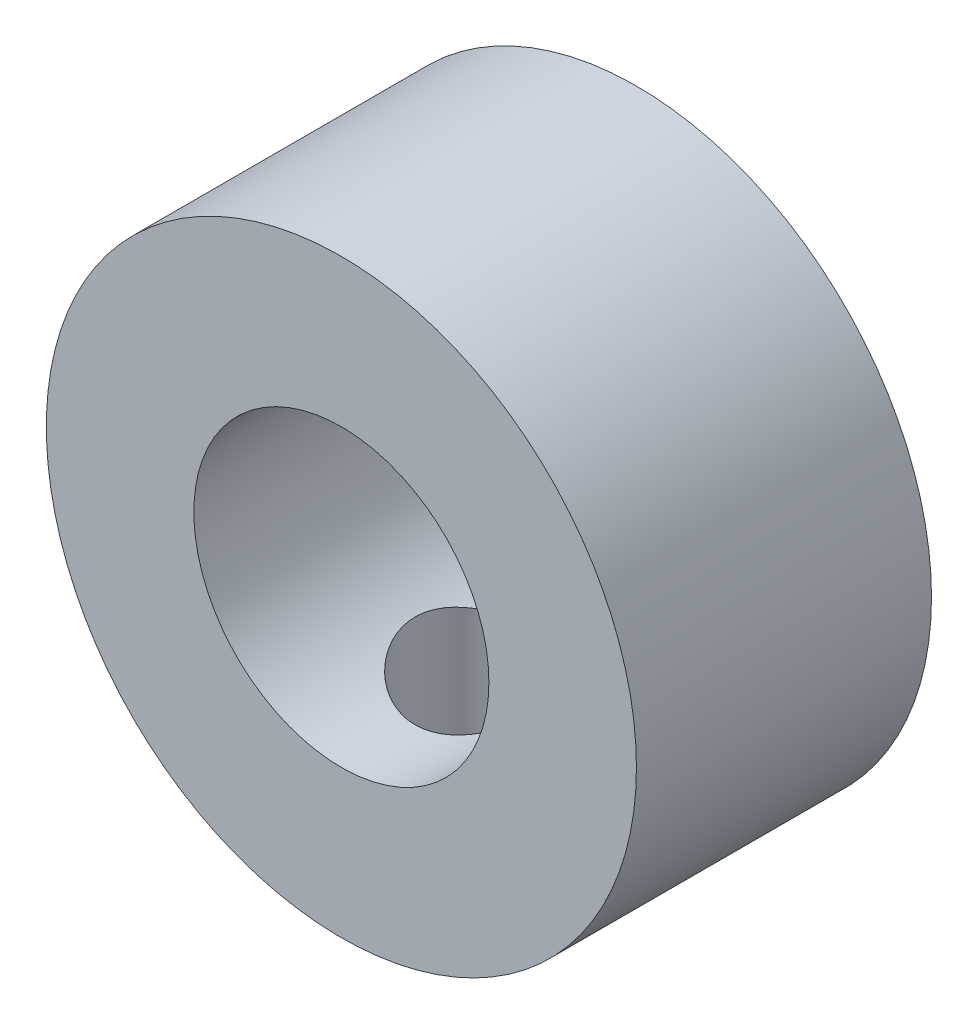
ISO-10303-21;
HEADER;
FILE_DESCRIPTION(('STEP AP214'),'2;1');
FILE_NAME('part.step','',(''),(''),'','','');
FILE_SCHEMA(('AUTOMOTIVE_DESIGN { 1 0 10303 214 1 1 1 1 }'));
ENDSEC;
DATA;
#1=APPLICATION_CONTEXT('core data for automotive mechanical design processes');
#2=APPLICATION_PROTOCOL_DEFINITION('international standard','automotive_design',2000,#1);
#3=PRODUCT_CONTEXT('',#1,'mechanical');
#4=PRODUCT('Part','Part','',(#3));
#5=PRODUCT_RELATED_PRODUCT_CATEGORY('part','',(#4));
#6=PRODUCT_DEFINITION_FORMATION('','',#4);
#7=PRODUCT_DEFINITION_CONTEXT('part definition',#1,'design');
#8=PRODUCT_DEFINITION('design','',#6,#7);
#9=PRODUCT_DEFINITION_SHAPE('','',#8);
#10=(LENGTH_UNIT() NAMED_UNIT(*) SI_UNIT(.MILLI.,.METRE.));
#11=(NAMED_UNIT(*) PLANE_ANGLE_UNIT() SI_UNIT($,.RADIAN.));
#12=(NAMED_UNIT(*) SI_UNIT($,.STERADIAN.) SOLID_ANGLE_UNIT());
#13=UNCERTAINTY_MEASURE_WITH_UNIT(LENGTH_MEASURE(1.E-05),#10,'distance_accuracy_value','');
#14=(GEOMETRIC_REPRESENTATION_CONTEXT(3) GLOBAL_UNCERTAINTY_ASSIGNED_CONTEXT((#13)) GLOBAL_UNIT_ASSIGNED_CONTEXT((#10,
#11,#12)) REPRESENTATION_CONTEXT('',''));
#15=CARTESIAN_POINT('',(0.,0.,0.));
#16=DIRECTION('',(0.,0.,1.));
#17=DIRECTION('',(1.,0.,0.));
#18=AXIS2_PLACEMENT_3D('',#15,#16,#17);
#19=CARTESIAN_POINT('',(0.,0.,5.));
#20=DIRECTION('',(0.,0.,1.));
#21=DIRECTION('',(1.,0.,0.));
#22=AXIS2_PLACEMENT_3D('',#19,#20,#21);
#23=PLANE('',#22);
#24=CARTESIAN_POINT('',(0.,0.,5.));
#25=DIRECTION('',(0.,0.,1.));
#26=DIRECTION('',(1.,0.,0.));
#27=AXIS2_PLACEMENT_3D('',#24,#25,#26);
#28=CIRCLE('',#27,5.);
#29=CARTESIAN_POINT('',(5.,0.,5.));
#30=VERTEX_POINT('',#29);
#31=EDGE_CURVE('E10',#30,#30,#28,.T.);
#32=ORIENTED_EDGE('',*,*,#31,.T.);
#33=EDGE_LOOP('',(#32));
#34=FACE_BOUND('',#33,.T.);
#35=CARTESIAN_POINT('',(0.,0.,5.));
#36=DIRECTION('',(0.,0.,1.));
#37=DIRECTION('',(1.,0.,0.));
#38=AXIS2_PLACEMENT_3D('',#35,#36,#37);
#39=CIRCLE('',#38,2.5);
#40=CARTESIAN_POINT('',(2.5,0.,5.));
#41=VERTEX_POINT('',#40);
#42=EDGE_CURVE('E56',#41,#41,#39,.T.);
#43=ORIENTED_EDGE('',*,*,#42,.F.);
#44=EDGE_LOOP('',(#43));
#45=FACE_BOUND('',#44,.T.);
#46=ADVANCED_FACE('F37',(#34,#45),#23,.T.);
#47=CARTESIAN_POINT('',(0.,0.,0.));
#48=DIRECTION('',(0.,0.,1.));
#49=DIRECTION('',(1.,0.,0.));
#50=AXIS2_PLACEMENT_3D('',#47,#48,#49);
#51=PLANE('',#50);
#52=CARTESIAN_POINT('',(0.,0.,0.));
#53=DIRECTION('',(0.,0.,1.));
#54=DIRECTION('',(1.,0.,0.));
#55=AXIS2_PLACEMENT_3D('',#52,#53,#54);
#56=CIRCLE('',#55,5.);
#57=CARTESIAN_POINT('',(5.,0.,0.));
#58=VERTEX_POINT('',#57);
#59=EDGE_CURVE('E51',#58,#58,#56,.T.);
#60=ORIENTED_EDGE('',*,*,#59,.F.);
#61=EDGE_LOOP('',(#60));
#62=FACE_BOUND('',#61,.T.);
#63=CARTESIAN_POINT('',(0.,0.,0.));
#64=DIRECTION('',(0.,0.,1.));
#65=DIRECTION('',(1.,0.,0.));
#66=AXIS2_PLACEMENT_3D('',#63,#64,#65);
#67=CIRCLE('',#66,2.5);
#68=CARTESIAN_POINT('',(2.5,0.,0.));
#69=VERTEX_POINT('',#68);
#70=EDGE_CURVE('E58',#69,#69,#67,.T.);
#71=ORIENTED_EDGE('',*,*,#70,.T.);
#72=EDGE_LOOP('',(#71));
#73=FACE_BOUND('',#72,.T.);
#74=ADVANCED_FACE('F79',(#62,#73),#51,.F.);
#75=CARTESIAN_POINT('',(0.,0.,5.));
#76=DIRECTION('',(0.,0.,-1.));
#77=DIRECTION('',(-1.,0.,0.));
#78=AXIS2_PLACEMENT_3D('',#75,#76,#77);
#79=CYLINDRICAL_SURFACE('',#78,5.);
#80=CARTESIAN_POINT('',(0.,-5.,3.75));
#81=CARTESIAN_POINT('',(0.0690634072247759,-4.99999883223344,3.74999806188487));
#82=CARTESIAN_POINT('',(0.138148464858969,-4.99855481776523,3.74425704102184));
#83=CARTESIAN_POINT('',(0.27433860314211,-4.99293428191577,3.7214790405775));
#84=CARTESIAN_POINT('',(0.341442539058949,-4.98875621183307,3.70443565871846));
#85=CARTESIAN_POINT('',(0.471684060152148,-4.97813021943366,3.65963395544826));
#86=CARTESIAN_POINT('',(0.534826302858336,-4.97168502368406,3.6318885010706));
#87=CARTESIAN_POINT('',(0.655560109920356,-4.95721119839661,3.56651550829597));
#88=CARTESIAN_POINT('',(0.713151486957299,-4.94918251545042,3.52888763656755));
#89=CARTESIAN_POINT('',(0.822334939417433,-4.93222844659834,3.44399934195482));
#90=CARTESIAN_POINT('',(0.873796408384227,-4.92328922623777,3.39657368753402));
#91=CARTESIAN_POINT('',(0.968124106002754,-4.90561350097941,3.29378982924257));
#92=CARTESIAN_POINT('',(1.01098936412428,-4.89687701906957,3.23843073087792));
#93=CARTESIAN_POINT('',(1.08752211899919,-4.88045646416425,3.12033731105214));
#94=CARTESIAN_POINT('',(1.12104351327113,-4.87278995392171,3.05750564099133));
#95=CARTESIAN_POINT('',(1.17699742379211,-4.85957912343519,2.92687632361803));
#96=CARTESIAN_POINT('',(1.19943171286611,-4.85403446393991,2.85907947222853));
#97=CARTESIAN_POINT('',(1.23212903067024,-4.84583730597959,2.7218804181646));
#98=CARTESIAN_POINT('',(1.24262689027778,-4.84312909229522,2.65253758662517));
#99=CARTESIAN_POINT('',(1.25188481255654,-4.84074468781451,2.51302619248835));
#100=CARTESIAN_POINT('',(1.25064678484831,-4.8410680037387,2.44285776608449));
#101=CARTESIAN_POINT('',(1.2366554371994,-4.84466004580515,2.3054868268796));
#102=CARTESIAN_POINT('',(1.22418195015877,-4.84785719168233,2.23825364877909));
#103=CARTESIAN_POINT('',(1.18852015575259,-4.85672258063736,2.10686579090726));
#104=CARTESIAN_POINT('',(1.16533108505785,-4.8623909997558,2.04271133080918));
#105=CARTESIAN_POINT('',(1.10865789828096,-4.87562594920155,1.91855165312328));
#106=CARTESIAN_POINT('',(1.07507222269409,-4.88321106224518,1.85859485684204));
#107=CARTESIAN_POINT('',(0.998630230012462,-4.89941425705322,1.7450677418693));
#108=CARTESIAN_POINT('',(0.955772290674033,-4.90803251945613,1.69149854327729));
#109=CARTESIAN_POINT('',(0.860552853901015,-4.92563233783151,1.590663653588));
#110=CARTESIAN_POINT('',(0.807955215138217,-4.93461724564976,1.54362125828221));
#111=CARTESIAN_POINT('',(0.695509931253083,-4.95171637982321,1.45898229794675));
#112=CARTESIAN_POINT('',(0.63566206475662,-4.95983057957846,1.42138602144703));
#113=CARTESIAN_POINT('',(0.51009657390116,-4.97431443411819,1.35662451147968));
#114=CARTESIAN_POINT('',(0.44435949434052,-4.98067800106438,1.32949554978798));
#115=CARTESIAN_POINT('',(0.309063340119069,-4.99089930826182,1.28673557857536));
#116=CARTESIAN_POINT('',(0.239504999292071,-4.99475752782734,1.27110236965155));
#117=CARTESIAN_POINT('',(0.100449975325023,-4.99946249392812,1.25211869536764));
#118=CARTESIAN_POINT('',(0.0309972666568417,-5.00038377923565,1.24846414493725));
#119=CARTESIAN_POINT('',(-0.107527395667923,-4.99932337345376,1.25270750171291));
#120=CARTESIAN_POINT('',(-0.176599383037162,-4.99734194368205,1.26060436899928));
#121=CARTESIAN_POINT('',(-0.31134522398041,-4.99074650939464,1.28747575699282));
#122=CARTESIAN_POINT('',(-0.377054265807296,-4.98617195154843,1.30628438623082));
#123=CARTESIAN_POINT('',(-0.50438107704376,-4.97490588861778,1.35425590335704));
#124=CARTESIAN_POINT('',(-0.565998432527196,-4.9682141697491,1.38341983692764));
#125=CARTESIAN_POINT('',(-0.684602612024873,-4.95327756605259,1.45186344072894));
#126=CARTESIAN_POINT('',(-0.741487868196525,-4.94500722805777,1.4913134269973));
#127=CARTESIAN_POINT('',(-0.847938844702705,-4.92787090989516,1.57899159066414));
#128=CARTESIAN_POINT('',(-0.897503299144173,-4.91900482709754,1.62722128301409));
#129=CARTESIAN_POINT('',(-0.989158806727275,-4.90140797467309,1.73250163403705));
#130=CARTESIAN_POINT('',(-1.03103655635169,-4.89268586822734,1.78973975250202));
#131=CARTESIAN_POINT('',(-1.10459229917725,-4.87660731981032,1.91061052872143));
#132=CARTESIAN_POINT('',(-1.13627074513161,-4.86925081722522,1.97424290246646));
#133=CARTESIAN_POINT('',(-1.18829285050774,-4.85681745612221,2.10575476867756));
#134=CARTESIAN_POINT('',(-1.20870366387839,-4.85172712743255,2.17360635695334));
#135=CARTESIAN_POINT('',(-1.23778804996148,-4.84438953408486,2.31192469824092));
#136=CARTESIAN_POINT('',(-1.24646418956555,-4.84214164766613,2.38239087586041));
#137=CARTESIAN_POINT('',(-1.25169882527833,-4.84079084336631,2.52176751987934));
#138=CARTESIAN_POINT('',(-1.2485982481501,-4.8415994394022,2.59066452927061));
#139=CARTESIAN_POINT('',(-1.23114773192739,-4.84606590839869,2.72691990722332));
#140=CARTESIAN_POINT('',(-1.21679801890564,-4.84972372409881,2.79427830667804));
#141=CARTESIAN_POINT('',(-1.17744276620233,-4.85942717235602,2.92517371588784));
#142=CARTESIAN_POINT('',(-1.15250117056698,-4.86545846030258,2.98873108770017));
#143=CARTESIAN_POINT('',(-1.09272076133756,-4.8792312977069,3.11080448559474));
#144=CARTESIAN_POINT('',(-1.05788057502849,-4.88697308433977,3.1693198109891));
#145=CARTESIAN_POINT('',(-0.97822312386428,-4.90354695219593,3.28129552416835));
#146=CARTESIAN_POINT('',(-0.933169302426879,-4.91240220693131,3.3345842278533));
#147=CARTESIAN_POINT('',(-0.834824475991447,-4.93006689371905,3.43295587066284));
#148=CARTESIAN_POINT('',(-0.781531517717622,-4.93887631439216,3.47803685842747));
#149=CARTESIAN_POINT('',(-0.667056322252158,-4.95564713039719,3.55950942380384));
#150=CARTESIAN_POINT('',(-0.605748685263655,-4.9635902780489,3.59572884472632));
#151=CARTESIAN_POINT('',(-0.47772171625873,-4.97754104145932,3.65728955245044));
#152=CARTESIAN_POINT('',(-0.41100630286395,-4.98355004333151,3.68263863387378));
#153=CARTESIAN_POINT('',(-0.28700854436956,-4.99206716304618,3.71797652527471));
#154=CARTESIAN_POINT('',(-0.230316809090057,-4.99502154210576,3.72995936921119));
#155=CARTESIAN_POINT('',(-0.115755059613569,-4.9989883769329,3.74597161968495));
#156=CARTESIAN_POINT('',(-0.057885134368847,-5.00000097875745,3.75000162442108));
#157=CARTESIAN_POINT('',(0.,-5.,3.75));
#158=B_SPLINE_CURVE_WITH_KNOTS('',3,(#80,#81,#82,#83,#84,#85,#86,#87,#88,#89,#90,#91,#92,#93,
#94,#95,#96,#97,#98,#99,#100,#101,#102,#103,#104,#105,#106,#107,#108,#109,#110,#111,#112,#113,
#114,#115,#116,#117,#118,#119,#120,#121,#122,#123,#124,#125,#126,#127,#128,#129,#130,#131,#132,
#133,#134,#135,#136,#137,#138,#139,#140,#141,#142,#143,#144,#145,#146,#147,#148,#149,#150,#151,
#152,#153,#154,#155,#156,#157),.UNSPECIFIED.,.T.,.F.,(4,2,2,2,2,2,2,2,2,2,2,2,2,2,2,2,2,2,2,2,2,
2,2,2,2,2,2,2,2,2,2,2,2,2,2,2,2,2,4),(0.,0.206978093726575,0.414073531469916,0.620920751905088,
0.827774950141107,1.03845362864283,1.24915607983385,1.46298872954839,1.6767871764114,
1.88630245916192,2.09578365093914,2.30018747505848,2.50460586221699,2.71108773228233,
2.91760575696802,3.13001250807516,3.34242574631873,3.55556857507595,3.76867061407202,
3.97631924124397,4.18394917593952,4.38850228761698,4.59307606101909,4.80127989637793,
5.00951969173349,5.2228709100373,5.4362126562459,5.6482687884503,5.8602785271034,
6.06619816998844,6.27211367463362,6.47680333799539,6.68152140114085,6.89157980341592,
7.10168808142015,7.3156015458299,7.52936136517792,7.70285202451791,7.876329633692),.UNSPECIFIED.);
#159=CARTESIAN_POINT('',(0.,-5.,3.75));
#160=VERTEX_POINT('',#159);
#161=EDGE_CURVE('E61',#160,#160,#158,.T.);
#162=ORIENTED_EDGE('',*,*,#161,.T.);
#163=EDGE_LOOP('',(#162));
#164=FACE_BOUND('',#163,.T.);
#165=ORIENTED_EDGE('',*,*,#31,.F.);
#166=EDGE_LOOP('',(#165));
#167=FACE_BOUND('',#166,.T.);
#168=ORIENTED_EDGE('',*,*,#59,.T.);
#169=EDGE_LOOP('',(#168));
#170=FACE_BOUND('',#169,.T.);
#171=ADVANCED_FACE('F39',(#164,#167,#170),#79,.T.);
#172=CARTESIAN_POINT('',(0.,0.,5.));
#173=DIRECTION('',(0.,0.,-1.));
#174=DIRECTION('',(-1.,0.,0.));
#175=AXIS2_PLACEMENT_3D('',#172,#173,#174);
#176=CYLINDRICAL_SURFACE('',#175,2.5);
#177=CARTESIAN_POINT('',(0.,-2.5,3.75));
#178=CARTESIAN_POINT('',(0.0657149536912331,-2.49999641755189,3.74999587210062));
#179=CARTESIAN_POINT('',(0.131508249622541,-2.49738113774397,3.74478740859791));
#180=CARTESIAN_POINT('',(0.261150294085531,-2.48717695046745,3.72418389957385));
#181=CARTESIAN_POINT('',(0.32499510839188,-2.47957859786229,3.70876950875294));
#182=CARTESIAN_POINT('',(0.448666931100718,-2.46020349254139,3.66850773922901));
#183=CARTESIAN_POINT('',(0.508508503673975,-2.448442989719,3.64369701968998));
#184=CARTESIAN_POINT('',(0.623090771008206,-2.42182220644723,3.58553672329382));
#185=CARTESIAN_POINT('',(0.677831867487563,-2.40696217041913,3.55218781968893));
#186=CARTESIAN_POINT('',(0.784384772202399,-2.37445322822571,3.47560343814338));
#187=CARTESIAN_POINT('',(0.83581901390264,-2.3566899890942,3.43189190095045));
#188=CARTESIAN_POINT('',(0.930974306083722,-2.3207496280843,3.33684815094121));
#189=CARTESIAN_POINT('',(0.974689478883458,-2.30257220261294,3.28551018528445));
#190=CARTESIAN_POINT('',(1.05656500056285,-2.26623688996684,3.17189581309577));
#191=CARTESIAN_POINT('',(1.09403166943955,-2.24818983712665,3.10907987706761));
#192=CARTESIAN_POINT('',(1.15771028361337,-2.21607473465401,2.97704083001723));
#193=CARTESIAN_POINT('',(1.18393026870792,-2.20200384508737,2.90782233909656));
#194=CARTESIAN_POINT('',(1.22266555273574,-2.18072333797261,2.7691686182226));
#195=CARTESIAN_POINT('',(1.23590732135055,-2.17315339479642,2.69999443491576));
#196=CARTESIAN_POINT('',(1.25053374163606,-2.1647736243566,2.56002645277565));
#197=CARTESIAN_POINT('',(1.25193011046634,-2.1639571167911,2.48923432391106));
#198=CARTESIAN_POINT('',(1.24335910896537,-2.16888662821561,2.35714246960579));
#199=CARTESIAN_POINT('',(1.23473069942103,-2.17385954577517,2.29571996097119));
#200=CARTESIAN_POINT('',(1.20867481132117,-2.18845285917313,2.1753476132837));
#201=CARTESIAN_POINT('',(1.19124452987206,-2.1980747353972,2.11639856836836));
#202=CARTESIAN_POINT('',(1.1477622254825,-2.22109345515926,2.00096358429293));
#203=CARTESIAN_POINT('',(1.12151883389499,-2.23457300829998,1.94456700151776));
#204=CARTESIAN_POINT('',(1.061302109585,-2.26379255351755,1.83670713426249));
#205=CARTESIAN_POINT('',(1.02732530476558,-2.27953355975238,1.78524608049989));
#206=CARTESIAN_POINT('',(0.947582568640986,-2.31391447379107,1.68184843407097));
#207=CARTESIAN_POINT('',(0.900868072961602,-2.33266887795933,1.6306789080298));
#208=CARTESIAN_POINT('',(0.799444473426717,-2.36934529125509,1.53658072676137));
#209=CARTESIAN_POINT('',(0.744731570717857,-2.38726689948501,1.49365600995765));
#210=CARTESIAN_POINT('',(0.62564563228981,-2.42127484103705,1.41539292371284));
#211=CARTESIAN_POINT('',(0.560941989499261,-2.43723730202509,1.38049940944282));
#212=CARTESIAN_POINT('',(0.425582769360996,-2.46447351401553,1.32237871369624));
#213=CARTESIAN_POINT('',(0.354931970331596,-2.47575098679441,1.29914226873104));
#214=CARTESIAN_POINT('',(0.215958114575877,-2.49155417176795,1.26690574535416));
#215=CARTESIAN_POINT('',(0.147926913185405,-2.4965617287664,1.25688595531653));
#216=CARTESIAN_POINT('',(0.0109744999366917,-2.50091266823877,1.24816908608189));
#217=CARTESIAN_POINT('',(-0.057946274837377,-2.5002587340164,1.24946664295065));
#218=CARTESIAN_POINT('',(-0.189041214982492,-2.49363990316801,1.26275836052344));
#219=CARTESIAN_POINT('',(-0.251324260062443,-2.48809057110237,1.27391566591254));
#220=CARTESIAN_POINT('',(-0.373008615377396,-2.47277714143524,1.30529758986886));
#221=CARTESIAN_POINT('',(-0.432409607113746,-2.46301257917916,1.3255232080667));
#222=CARTESIAN_POINT('',(-0.548610760562082,-2.43980314267087,1.37499808304146));
#223=CARTESIAN_POINT('',(-0.605287996257692,-2.42626102212424,1.40448881264602));
#224=CARTESIAN_POINT('',(-0.713076702123651,-2.39679967896386,1.47138441955755));
#225=CARTESIAN_POINT('',(-0.764185787219103,-2.38087944457231,1.50879266824179));
#226=CARTESIAN_POINT('',(-0.864709611613317,-2.3463527667183,1.59470053166609));
#227=CARTESIAN_POINT('',(-0.913465097280799,-2.32763606060552,1.64392858556696));
#228=CARTESIAN_POINT('',(-1.00232040139155,-2.29077989504843,1.74990643908663));
#229=CARTESIAN_POINT('',(-1.04241423211355,-2.27264084226908,1.80666139852047));
#230=CARTESIAN_POINT('',(-1.11463489312212,-2.23813990282585,1.92955456775039));
#231=CARTESIAN_POINT('',(-1.1462818698483,-2.2219066207934,1.99601408276074));
#232=CARTESIAN_POINT('',(-1.19760353251725,-2.19467590460158,2.13438758461565));
#233=CARTESIAN_POINT('',(-1.21729364485946,-2.18367172800773,2.20629440812648));
#234=CARTESIAN_POINT('',(-1.2423271093121,-2.16951876260833,2.34613777857681));
#235=CARTESIAN_POINT('',(-1.24886624550108,-2.16571729325614,2.41379281678629));
#236=CARTESIAN_POINT('',(-1.25086144297598,-2.16456693307719,2.54930883396341));
#237=CARTESIAN_POINT('',(-1.2463223082805,-2.16721524534441,2.61716971092429));
#238=CARTESIAN_POINT('',(-1.22740765699033,-2.17797327562531,2.74435437691502));
#239=CARTESIAN_POINT('',(-1.2140103929285,-2.18553868102992,2.8038755876805));
#240=CARTESIAN_POINT('',(-1.17896919778081,-2.20463770234897,2.91976014928088));
#241=CARTESIAN_POINT('',(-1.15732261394976,-2.21617259462095,2.97612247761496));
#242=CARTESIAN_POINT('',(-1.10476968162585,-2.2428566295566,3.08828106373326));
#243=CARTESIAN_POINT('',(-1.07333892227057,-2.25819652995238,3.14378487728713));
#244=CARTESIAN_POINT('',(-1.00268871454579,-2.29044164543238,3.24909317022573));
#245=CARTESIAN_POINT('',(-0.96346521404831,-2.30734767243153,3.29889466314811));
#246=CARTESIAN_POINT('',(-0.872754158330802,-2.34327903949141,3.39767747794702));
#247=CARTESIAN_POINT('',(-0.820355528762715,-2.36231229139336,3.4458238779524));
#248=CARTESIAN_POINT('',(-0.70769350777535,-2.3984719031886,3.53282872927954));
#249=CARTESIAN_POINT('',(-0.647425904070981,-2.4155972326005,3.57168217428286));
#250=CARTESIAN_POINT('',(-0.519914496024933,-2.44622511981379,3.63904545345276));
#251=CARTESIAN_POINT('',(-0.452624379918267,-2.45970120703636,3.66748021176429));
#252=CARTESIAN_POINT('',(-0.313427626617738,-2.48126676704332,3.71226020989869));
#253=CARTESIAN_POINT('',(-0.241534749528957,-2.48937154216165,3.72863980853697));
#254=CARTESIAN_POINT('',(-0.140752433104229,-2.49619327387079,3.74237176384481));
#255=CARTESIAN_POINT('',(-0.112702349299373,-2.49761706674002,3.74522830107952));
#256=CARTESIAN_POINT('',(-0.0564396647589467,-2.49952121222331,3.74904333189601));
#257=CARTESIAN_POINT('',(-0.0282270595592265,-2.50000153879704,3.750001773089));
#258=CARTESIAN_POINT('',(0.,-2.5,3.75));
#259=B_SPLINE_CURVE_WITH_KNOTS('',3,(#177,#178,#179,#180,#181,#182,#183,#184,#185,#186,#187,
#188,#189,#190,#191,#192,#193,#194,#195,#196,#197,#198,#199,#200,#201,#202,#203,#204,#205,#206,
#207,#208,#209,#210,#211,#212,#213,#214,#215,#216,#217,#218,#219,#220,#221,#222,#223,#224,#225,
#226,#227,#228,#229,#230,#231,#232,#233,#234,#235,#236,#237,#238,#239,#240,#241,#242,#243,#244,
#245,#246,#247,#248,#249,#250,#251,#252,#253,#254,#255,#256,#257,#258),.UNSPECIFIED.,.T.,.F.,(4,
2,2,2,2,2,2,2,2,2,2,2,2,2,2,2,2,2,2,2,2,2,2,2,2,2,2,2,2,2,2,2,2,2,2,2,2,2,2,2,4),(0.,
0.197030321775366,0.394435187136497,0.591077694365373,0.78770470072696,0.996227198397611,
1.20490779706754,1.42977158038441,1.65447434872851,1.86572515175287,2.07676696661276,
2.26257140511651,2.44843504907098,2.63862800210609,2.82890651575277,3.04331176667348,
3.25781918248358,3.48228777768051,3.7065777114035,3.91229113089182,4.11790705639345,
4.30758633132653,4.49728652038664,4.69241070034873,4.88761813435424,5.10199513305524,
5.3165198576929,5.54143352699593,5.76605639925972,5.96911634372967,6.17208824825007,
6.35572412805228,6.53941910979598,6.73545570969518,6.93159451423697,7.15156553440623,
7.37165479220716,7.59330017078657,7.81431135781163,7.89894100172122,7.98357298143558),.UNSPECIFIED.);
#260=CARTESIAN_POINT('',(0.,-2.5,3.75));
#261=VERTEX_POINT('',#260);
#262=EDGE_CURVE('E42',#261,#261,#259,.T.);
#263=ORIENTED_EDGE('',*,*,#262,.F.);
#264=EDGE_LOOP('',(#263));
#265=FACE_BOUND('',#264,.T.);
#266=ORIENTED_EDGE('',*,*,#42,.T.);
#267=EDGE_LOOP('',(#266));
#268=FACE_BOUND('',#267,.T.);
#269=ORIENTED_EDGE('',*,*,#70,.F.);
#270=EDGE_LOOP('',(#269));
#271=FACE_BOUND('',#270,.T.);
#272=ADVANCED_FACE('F71',(#265,#268,#271),#176,.F.);
#273=CARTESIAN_POINT('',(0.,-5.,2.5));
#274=DIRECTION('',(0.,1.,0.));
#275=DIRECTION('',(0.,0.,1.));
#276=AXIS2_PLACEMENT_3D('',#273,#274,#275);
#277=CYLINDRICAL_SURFACE('',#276,1.25);
#278=ORIENTED_EDGE('',*,*,#262,.T.);
#279=EDGE_LOOP('',(#278));
#280=FACE_BOUND('',#279,.T.);
#281=ORIENTED_EDGE('',*,*,#161,.F.);
#282=EDGE_LOOP('',(#281));
#283=FACE_BOUND('',#282,.T.);
#284=ADVANCED_FACE('F68',(#280,#283),#277,.F.);
#285=CLOSED_SHELL('',(#46,#74,#171,#272,#284));
#286=MANIFOLD_SOLID_BREP('B2',#285);
#287=ADVANCED_BREP_SHAPE_REPRESENTATION('',(#18,#286),#14);
#288=SHAPE_DEFINITION_REPRESENTATION(#9,#287);
ENDSEC;
END-ISO-10303-21;
